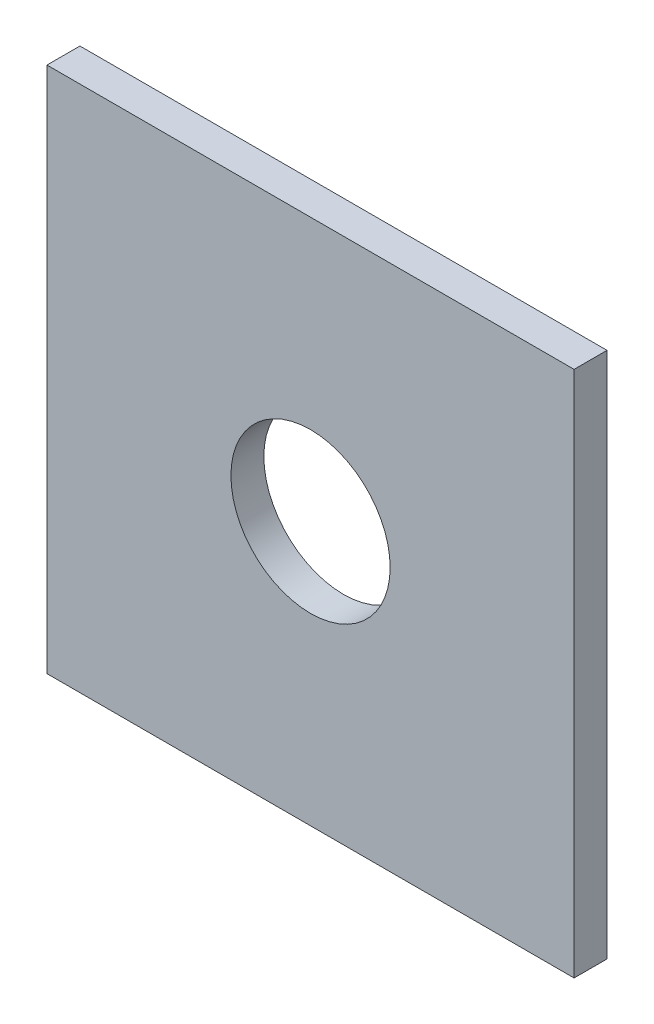
ISO-10303-21;
HEADER;
FILE_DESCRIPTION(('STEP AP214'),'2;1');
FILE_NAME('part.step','',(''),(''),'','','');
FILE_SCHEMA(('AUTOMOTIVE_DESIGN { 1 0 10303 214 1 1 1 1 }'));
ENDSEC;
DATA;
#1=APPLICATION_CONTEXT('core data for automotive mechanical design processes');
#2=APPLICATION_PROTOCOL_DEFINITION('international standard','automotive_design',2000,#1);
#3=PRODUCT_CONTEXT('',#1,'mechanical');
#4=PRODUCT('Part','Part','',(#3));
#5=PRODUCT_RELATED_PRODUCT_CATEGORY('part','',(#4));
#6=PRODUCT_DEFINITION_FORMATION('','',#4);
#7=PRODUCT_DEFINITION_CONTEXT('part definition',#1,'design');
#8=PRODUCT_DEFINITION('design','',#6,#7);
#9=PRODUCT_DEFINITION_SHAPE('','',#8);
#10=(LENGTH_UNIT() NAMED_UNIT(*) SI_UNIT(.MILLI.,.METRE.));
#11=(NAMED_UNIT(*) PLANE_ANGLE_UNIT() SI_UNIT($,.RADIAN.));
#12=(NAMED_UNIT(*) SI_UNIT($,.STERADIAN.) SOLID_ANGLE_UNIT());
#13=UNCERTAINTY_MEASURE_WITH_UNIT(LENGTH_MEASURE(1.E-05),#10,'distance_accuracy_value','');
#14=(GEOMETRIC_REPRESENTATION_CONTEXT(3) GLOBAL_UNCERTAINTY_ASSIGNED_CONTEXT((#13)) GLOBAL_UNIT_ASSIGNED_CONTEXT((#10,
#11,#12)) REPRESENTATION_CONTEXT('',''));
#15=CARTESIAN_POINT('',(0.,0.,0.));
#16=DIRECTION('',(0.,0.,1.));
#17=DIRECTION('',(1.,0.,0.));
#18=AXIS2_PLACEMENT_3D('',#15,#16,#17);
#19=CARTESIAN_POINT('',(0.,0.,19.05));
#20=DIRECTION('',(0.,0.,-1.));
#21=DIRECTION('',(-1.,0.,0.));
#22=AXIS2_PLACEMENT_3D('',#19,#20,#21);
#23=PLANE('',#22);
#24=DIRECTION('',(0.,-1.,0.));
#25=VECTOR('',#24,1.);
#26=CARTESIAN_POINT('',(-152.4,152.4,19.05));
#27=LINE('',#26,#25);
#28=CARTESIAN_POINT('',(-152.4,152.4,19.05));
#29=VERTEX_POINT('',#28);
#30=CARTESIAN_POINT('',(-152.4,-152.4,19.05));
#31=VERTEX_POINT('',#30);
#32=EDGE_CURVE('E94',#29,#31,#27,.T.);
#33=ORIENTED_EDGE('',*,*,#32,.T.);
#34=DIRECTION('',(1.,0.,0.));
#35=VECTOR('',#34,1.);
#36=CARTESIAN_POINT('',(152.4,-152.4,19.05));
#37=LINE('',#36,#35);
#38=CARTESIAN_POINT('',(152.4,-152.4,19.05));
#39=VERTEX_POINT('',#38);
#40=EDGE_CURVE('E89',#31,#39,#37,.T.);
#41=ORIENTED_EDGE('',*,*,#40,.T.);
#42=DIRECTION('',(0.,1.,0.));
#43=VECTOR('',#42,1.);
#44=CARTESIAN_POINT('',(152.4,152.4,19.05));
#45=LINE('',#44,#43);
#46=CARTESIAN_POINT('',(152.4,152.4,19.05));
#47=VERTEX_POINT('',#46);
#48=EDGE_CURVE('E92',#39,#47,#45,.T.);
#49=ORIENTED_EDGE('',*,*,#48,.T.);
#50=DIRECTION('',(-1.,0.,0.));
#51=VECTOR('',#50,1.);
#52=CARTESIAN_POINT('',(152.4,152.4,19.05));
#53=LINE('',#52,#51);
#54=EDGE_CURVE('E59',#47,#29,#53,.T.);
#55=ORIENTED_EDGE('',*,*,#54,.T.);
#56=EDGE_LOOP('',(#33,#41,#49,#55));
#57=FACE_BOUND('',#56,.T.);
#58=CARTESIAN_POINT('',(0.,0.,19.05));
#59=DIRECTION('',(0.,0.,1.));
#60=DIRECTION('',(1.,0.,0.));
#61=AXIS2_PLACEMENT_3D('',#58,#59,#60);
#62=CIRCLE('',#61,46.0375);
#63=CARTESIAN_POINT('',(-46.0375000000001,0.,19.05));
#64=VERTEX_POINT('',#63);
#65=EDGE_CURVE('E114',#64,#64,#62,.T.);
#66=ORIENTED_EDGE('',*,*,#65,.F.);
#67=EDGE_LOOP('',(#66));
#68=FACE_BOUND('',#67,.T.);
#69=ADVANCED_FACE('F41',(#57,#68),#23,.F.);
#70=CARTESIAN_POINT('',(0.,0.,0.));
#71=DIRECTION('',(0.,0.,-1.));
#72=DIRECTION('',(-1.,0.,0.));
#73=AXIS2_PLACEMENT_3D('',#70,#71,#72);
#74=PLANE('',#73);
#75=CARTESIAN_POINT('',(-71.8420489685531,71.8420489685533,0.));
#76=DIRECTION('',(0.,0.,1.));
#77=DIRECTION('',(1.,0.,0.));
#78=AXIS2_PLACEMENT_3D('',#75,#76,#77);
#79=CIRCLE('',#78,7.9375);
#80=CARTESIAN_POINT('',(-63.9045489685531,71.8420489685533,0.));
#81=VERTEX_POINT('',#80);
#82=EDGE_CURVE('E144',#81,#81,#79,.T.);
#83=ORIENTED_EDGE('',*,*,#82,.T.);
#84=EDGE_LOOP('',(#83));
#85=FACE_BOUND('',#84,.T.);
#86=CARTESIAN_POINT('',(71.8420489685531,-71.8420489685533,0.));
#87=DIRECTION('',(0.,0.,1.));
#88=DIRECTION('',(1.,0.,0.));
#89=AXIS2_PLACEMENT_3D('',#86,#87,#88);
#90=CIRCLE('',#89,7.9375);
#91=CARTESIAN_POINT('',(79.7795489685531,-71.8420489685533,0.));
#92=VERTEX_POINT('',#91);
#93=EDGE_CURVE('E145',#92,#92,#90,.T.);
#94=ORIENTED_EDGE('',*,*,#93,.T.);
#95=EDGE_LOOP('',(#94));
#96=FACE_BOUND('',#95,.T.);
#97=DIRECTION('',(0.,-1.,0.));
#98=VECTOR('',#97,1.);
#99=CARTESIAN_POINT('',(-152.4,152.4,0.));
#100=LINE('',#99,#98);
#101=CARTESIAN_POINT('',(-152.4,152.4,0.));
#102=VERTEX_POINT('',#101);
#103=CARTESIAN_POINT('',(-152.4,-152.4,0.));
#104=VERTEX_POINT('',#103);
#105=EDGE_CURVE('E110',#102,#104,#100,.T.);
#106=ORIENTED_EDGE('',*,*,#105,.F.);
#107=DIRECTION('',(-1.,0.,0.));
#108=VECTOR('',#107,1.);
#109=CARTESIAN_POINT('',(152.4,152.4,0.));
#110=LINE('',#109,#108);
#111=CARTESIAN_POINT('',(152.4,152.4,0.));
#112=VERTEX_POINT('',#111);
#113=EDGE_CURVE('E82',#112,#102,#110,.T.);
#114=ORIENTED_EDGE('',*,*,#113,.F.);
#115=DIRECTION('',(0.,1.,0.));
#116=VECTOR('',#115,1.);
#117=CARTESIAN_POINT('',(152.4,152.4,0.));
#118=LINE('',#117,#116);
#119=CARTESIAN_POINT('',(152.4,-152.4,0.));
#120=VERTEX_POINT('',#119);
#121=EDGE_CURVE('E76',#120,#112,#118,.T.);
#122=ORIENTED_EDGE('',*,*,#121,.F.);
#123=DIRECTION('',(1.,0.,0.));
#124=VECTOR('',#123,1.);
#125=CARTESIAN_POINT('',(152.4,-152.4,0.));
#126=LINE('',#125,#124);
#127=EDGE_CURVE('E99',#104,#120,#126,.T.);
#128=ORIENTED_EDGE('',*,*,#127,.F.);
#129=EDGE_LOOP('',(#106,#114,#122,#128));
#130=FACE_BOUND('',#129,.T.);
#131=CARTESIAN_POINT('',(0.,0.,0.));
#132=DIRECTION('',(0.,0.,1.));
#133=DIRECTION('',(1.,0.,0.));
#134=AXIS2_PLACEMENT_3D('',#131,#132,#133);
#135=CIRCLE('',#134,46.0375);
#136=CARTESIAN_POINT('',(-46.0375000000001,0.,0.));
#137=VERTEX_POINT('',#136);
#138=EDGE_CURVE('E132',#137,#137,#135,.T.);
#139=ORIENTED_EDGE('',*,*,#138,.T.);
#140=EDGE_LOOP('',(#139));
#141=FACE_BOUND('',#140,.T.);
#142=ADVANCED_FACE('F127',(#85,#96,#130,#141),#74,.T.);
#143=CARTESIAN_POINT('',(-152.4,152.4,19.05));
#144=DIRECTION('',(1.,0.,0.));
#145=DIRECTION('',(0.,1.,0.));
#146=AXIS2_PLACEMENT_3D('',#143,#144,#145);
#147=PLANE('',#146);
#148=ORIENTED_EDGE('',*,*,#105,.T.);
#149=DIRECTION('',(0.,0.,-1.));
#150=VECTOR('',#149,1.);
#151=CARTESIAN_POINT('',(-152.4,-152.4,19.05));
#152=LINE('',#151,#150);
#153=EDGE_CURVE('E12',#31,#104,#152,.T.);
#154=ORIENTED_EDGE('',*,*,#153,.F.);
#155=ORIENTED_EDGE('',*,*,#32,.F.);
#156=DIRECTION('',(0.,0.,-1.));
#157=VECTOR('',#156,1.);
#158=CARTESIAN_POINT('',(-152.4,152.4,19.05));
#159=LINE('',#158,#157);
#160=EDGE_CURVE('E106',#29,#102,#159,.T.);
#161=ORIENTED_EDGE('',*,*,#160,.T.);
#162=EDGE_LOOP('',(#148,#154,#155,#161));
#163=FACE_BOUND('',#162,.T.);
#164=ADVANCED_FACE('F43',(#163),#147,.F.);
#165=CARTESIAN_POINT('',(152.4,-152.4,19.05));
#166=DIRECTION('',(0.,1.,0.));
#167=DIRECTION('',(-1.,0.,0.));
#168=AXIS2_PLACEMENT_3D('',#165,#166,#167);
#169=PLANE('',#168);
#170=ORIENTED_EDGE('',*,*,#127,.T.);
#171=DIRECTION('',(0.,0.,-1.));
#172=VECTOR('',#171,1.);
#173=CARTESIAN_POINT('',(152.4,-152.4,19.05));
#174=LINE('',#173,#172);
#175=EDGE_CURVE('E51',#39,#120,#174,.T.);
#176=ORIENTED_EDGE('',*,*,#175,.F.);
#177=ORIENTED_EDGE('',*,*,#40,.F.);
#178=ORIENTED_EDGE('',*,*,#153,.T.);
#179=EDGE_LOOP('',(#170,#176,#177,#178));
#180=FACE_BOUND('',#179,.T.);
#181=ADVANCED_FACE('F98',(#180),#169,.F.);
#182=CARTESIAN_POINT('',(152.4,152.4,19.05));
#183=DIRECTION('',(-1.,0.,0.));
#184=DIRECTION('',(0.,-1.,0.));
#185=AXIS2_PLACEMENT_3D('',#182,#183,#184);
#186=PLANE('',#185);
#187=ORIENTED_EDGE('',*,*,#121,.T.);
#188=DIRECTION('',(0.,0.,-1.));
#189=VECTOR('',#188,1.);
#190=CARTESIAN_POINT('',(152.4,152.4,19.05));
#191=LINE('',#190,#189);
#192=EDGE_CURVE('E101',#47,#112,#191,.T.);
#193=ORIENTED_EDGE('',*,*,#192,.F.);
#194=ORIENTED_EDGE('',*,*,#48,.F.);
#195=ORIENTED_EDGE('',*,*,#175,.T.);
#196=EDGE_LOOP('',(#187,#193,#194,#195));
#197=FACE_BOUND('',#196,.T.);
#198=ADVANCED_FACE('F102',(#197),#186,.F.);
#199=CARTESIAN_POINT('',(152.4,152.4,19.05));
#200=DIRECTION('',(0.,-1.,0.));
#201=DIRECTION('',(1.,0.,0.));
#202=AXIS2_PLACEMENT_3D('',#199,#200,#201);
#203=PLANE('',#202);
#204=ORIENTED_EDGE('',*,*,#113,.T.);
#205=ORIENTED_EDGE('',*,*,#160,.F.);
#206=ORIENTED_EDGE('',*,*,#54,.F.);
#207=ORIENTED_EDGE('',*,*,#192,.T.);
#208=EDGE_LOOP('',(#204,#205,#206,#207));
#209=FACE_BOUND('',#208,.T.);
#210=ADVANCED_FACE('F124',(#209),#203,.F.);
#211=CARTESIAN_POINT('',(0.,0.,19.05));
#212=DIRECTION('',(0.,0.,-1.));
#213=DIRECTION('',(-1.,0.,0.));
#214=AXIS2_PLACEMENT_3D('',#211,#212,#213);
#215=CYLINDRICAL_SURFACE('',#214,46.0375);
#216=CARTESIAN_POINT('',(-46.0375000000001,0.,19.05));
#217=CARTESIAN_POINT('',(-46.0375000000001,0.,18.8515625));
#218=CARTESIAN_POINT('',(-46.0375000000001,0.,18.653125));
#219=CARTESIAN_POINT('',(-46.0375000000001,0.,18.25625));
#220=CARTESIAN_POINT('',(-46.0375000000001,0.,18.0578125));
#221=CARTESIAN_POINT('',(-46.0375000000001,0.,17.6609375));
#222=CARTESIAN_POINT('',(-46.0375000000001,0.,17.4625));
#223=CARTESIAN_POINT('',(-46.0375000000001,0.,17.065625));
#224=CARTESIAN_POINT('',(-46.0375000000001,0.,16.8671875));
#225=CARTESIAN_POINT('',(-46.0375000000001,0.,16.4703125));
#226=CARTESIAN_POINT('',(-46.0375000000001,0.,16.271875));
#227=CARTESIAN_POINT('',(-46.0375000000001,0.,15.875));
#228=CARTESIAN_POINT('',(-46.0375000000001,0.,15.6765625));
#229=CARTESIAN_POINT('',(-46.0375000000001,0.,15.2796875));
#230=CARTESIAN_POINT('',(-46.0375000000001,0.,15.08125));
#231=CARTESIAN_POINT('',(-46.0375000000001,0.,14.684375));
#232=CARTESIAN_POINT('',(-46.0375000000001,0.,14.4859375));
#233=CARTESIAN_POINT('',(-46.0375000000001,0.,14.0890625));
#234=CARTESIAN_POINT('',(-46.0375000000001,0.,13.890625));
#235=CARTESIAN_POINT('',(-46.0375000000001,0.,13.49375));
#236=CARTESIAN_POINT('',(-46.0375000000001,0.,13.2953125));
#237=CARTESIAN_POINT('',(-46.0375000000001,0.,12.8984375));
#238=CARTESIAN_POINT('',(-46.0375000000001,0.,12.7));
#239=CARTESIAN_POINT('',(-46.0375000000001,0.,12.303125));
#240=CARTESIAN_POINT('',(-46.0375000000001,0.,12.1046875));
#241=CARTESIAN_POINT('',(-46.0375000000001,0.,11.7078125));
#242=CARTESIAN_POINT('',(-46.0375000000001,0.,11.509375));
#243=CARTESIAN_POINT('',(-46.0375000000001,0.,11.1125));
#244=CARTESIAN_POINT('',(-46.0375000000001,0.,10.9140625));
#245=CARTESIAN_POINT('',(-46.0375000000001,0.,10.5171875));
#246=CARTESIAN_POINT('',(-46.0375000000001,0.,10.31875));
#247=CARTESIAN_POINT('',(-46.0375000000001,0.,9.921875));
#248=CARTESIAN_POINT('',(-46.0375000000001,0.,9.7234375));
#249=CARTESIAN_POINT('',(-46.0375000000001,0.,9.3265625));
#250=CARTESIAN_POINT('',(-46.0375000000001,0.,9.128125));
#251=CARTESIAN_POINT('',(-46.0375000000001,0.,8.73125));
#252=CARTESIAN_POINT('',(-46.0375000000001,0.,8.5328125));
#253=CARTESIAN_POINT('',(-46.0375000000001,0.,8.1359375));
#254=CARTESIAN_POINT('',(-46.0375000000001,0.,7.9375));
#255=CARTESIAN_POINT('',(-46.0375000000001,0.,7.540625));
#256=CARTESIAN_POINT('',(-46.0375000000001,0.,7.3421875));
#257=CARTESIAN_POINT('',(-46.0375000000001,0.,6.9453125));
#258=CARTESIAN_POINT('',(-46.0375000000001,0.,6.746875));
#259=CARTESIAN_POINT('',(-46.0375000000001,0.,6.35));
#260=CARTESIAN_POINT('',(-46.0375000000001,0.,6.1515625));
#261=CARTESIAN_POINT('',(-46.0375000000001,0.,5.7546875));
#262=CARTESIAN_POINT('',(-46.0375000000001,0.,5.55625));
#263=CARTESIAN_POINT('',(-46.0375000000001,0.,5.159375));
#264=CARTESIAN_POINT('',(-46.0375000000001,0.,4.9609375));
#265=CARTESIAN_POINT('',(-46.0375000000001,0.,4.5640625));
#266=CARTESIAN_POINT('',(-46.0375000000001,0.,4.365625));
#267=CARTESIAN_POINT('',(-46.0375000000001,0.,3.96875));
#268=CARTESIAN_POINT('',(-46.0375000000001,0.,3.7703125));
#269=CARTESIAN_POINT('',(-46.0375000000001,0.,3.3734375));
#270=CARTESIAN_POINT('',(-46.0375000000001,0.,3.175));
#271=CARTESIAN_POINT('',(-46.0375000000001,0.,2.778125));
#272=CARTESIAN_POINT('',(-46.0375000000001,0.,2.5796875));
#273=CARTESIAN_POINT('',(-46.0375000000001,0.,2.1828125));
#274=CARTESIAN_POINT('',(-46.0375000000001,0.,1.984375));
#275=CARTESIAN_POINT('',(-46.0375000000001,0.,1.5875));
#276=CARTESIAN_POINT('',(-46.0375000000001,0.,1.3890625));
#277=CARTESIAN_POINT('',(-46.0375000000001,0.,0.992187500000001));
#278=CARTESIAN_POINT('',(-46.0375000000001,0.,0.793750000000001));
#279=CARTESIAN_POINT('',(-46.0375000000001,0.,0.396875));
#280=CARTESIAN_POINT('',(-46.0375000000001,0.,0.1984375));
#281=CARTESIAN_POINT('',(-46.0375000000001,0.,0.));
#282=B_SPLINE_CURVE_WITH_KNOTS('',3,(#216,#217,#218,#219,#220,#221,#222,#223,#224,#225,#226,
#227,#228,#229,#230,#231,#232,#233,#234,#235,#236,#237,#238,#239,#240,#241,#242,#243,#244,#245,
#246,#247,#248,#249,#250,#251,#252,#253,#254,#255,#256,#257,#258,#259,#260,#261,#262,#263,#264,
#265,#266,#267,#268,#269,#270,#271,#272,#273,#274,#275,#276,#277,#278,#279,#280,#281),
.UNSPECIFIED.,.F.,.F.,(4,2,2,2,2,2,2,2,2,2,2,2,2,2,2,2,2,2,2,2,2,2,2,2,2,2,2,2,2,2,2,2,4),(0.,
0.595312499999997,1.190625,1.7859375,2.38125,2.9765625,3.571875,4.1671875,4.7625,5.3578125,
5.953125,6.5484375,7.14375,7.7390625,8.334375,8.9296875,9.525,10.1203125,10.715625,11.3109375,
11.90625,12.5015625,13.096875,13.6921875,14.2875,14.8828125,15.478125,16.0734375,16.66875,
17.2640625,17.859375,18.4546875,19.05),.UNSPECIFIED.);
#283=EDGE_CURVE('BSEAM181',#64,#137,#282,.T.);
#284=ORIENTED_EDGE('',*,*,#65,.T.);
#285=ORIENTED_EDGE('',*,*,#138,.F.);
#286=ORIENTED_EDGE('',*,*,#283,.T.);
#287=ORIENTED_EDGE('',*,*,#283,.F.);
#288=EDGE_LOOP('',(#284,#286,#285,#287));
#289=FACE_BOUND('',#288,.T.);
#290=ADVANCED_FACE('F181',(#289),#215,.F.);
#291=CARTESIAN_POINT('',(71.8420489685531,-71.8420489685533,41.5006403026729));
#292=DIRECTION('',(0.,0.,-1.));
#293=DIRECTION('',(-1.,0.,0.));
#294=AXIS2_PLACEMENT_3D('',#291,#292,#293);
#295=CYLINDRICAL_SURFACE('',#294,7.9375);
#296=CARTESIAN_POINT('',(71.8420489685531,-71.8420489685533,15.875));
#297=DIRECTION('',(0.,0.,-1.));
#298=DIRECTION('',(-1.,0.,0.));
#299=AXIS2_PLACEMENT_3D('',#296,#297,#298);
#300=CIRCLE('',#299,7.9375);
#301=CARTESIAN_POINT('',(63.9045489685531,-71.8420489685533,15.875));
#302=VERTEX_POINT('',#301);
#303=EDGE_CURVE('E140',#302,#302,#300,.T.);
#304=ORIENTED_EDGE('',*,*,#303,.F.);
#305=EDGE_LOOP('',(#304));
#306=FACE_BOUND('',#305,.T.);
#307=ORIENTED_EDGE('',*,*,#93,.F.);
#308=EDGE_LOOP('',(#307));
#309=FACE_BOUND('',#308,.T.);
#310=ADVANCED_FACE('F170',(#306,#309),#295,.F.);
#311=CARTESIAN_POINT('',(0.,0.,15.875));
#312=DIRECTION('',(0.,0.,-1.));
#313=DIRECTION('',(-1.,0.,0.));
#314=AXIS2_PLACEMENT_3D('',#311,#312,#313);
#315=PLANE('',#314);
#316=ORIENTED_EDGE('',*,*,#303,.T.);
#317=EDGE_LOOP('',(#316));
#318=FACE_BOUND('',#317,.T.);
#319=ADVANCED_FACE('F161',(#318),#315,.T.);
#320=CARTESIAN_POINT('',(-71.8420489685531,71.8420489685533,41.5006403026729));
#321=DIRECTION('',(0.,0.,-1.));
#322=DIRECTION('',(-1.,0.,0.));
#323=AXIS2_PLACEMENT_3D('',#320,#321,#322);
#324=CYLINDRICAL_SURFACE('',#323,7.9375);
#325=CARTESIAN_POINT('',(-71.8420489685531,71.8420489685533,15.875));
#326=DIRECTION('',(0.,0.,-1.));
#327=DIRECTION('',(-1.,0.,0.));
#328=AXIS2_PLACEMENT_3D('',#325,#326,#327);
#329=CIRCLE('',#328,7.9375);
#330=CARTESIAN_POINT('',(-79.7795489685531,71.8420489685533,15.875));
#331=VERTEX_POINT('',#330);
#332=EDGE_CURVE('E136',#331,#331,#329,.T.);
#333=ORIENTED_EDGE('',*,*,#332,.F.);
#334=EDGE_LOOP('',(#333));
#335=FACE_BOUND('',#334,.T.);
#336=ORIENTED_EDGE('',*,*,#82,.F.);
#337=EDGE_LOOP('',(#336));
#338=FACE_BOUND('',#337,.T.);
#339=ADVANCED_FACE('F158',(#335,#338),#324,.F.);
#340=CARTESIAN_POINT('',(0.,0.,15.875));
#341=DIRECTION('',(0.,0.,-1.));
#342=DIRECTION('',(-1.,0.,0.));
#343=AXIS2_PLACEMENT_3D('',#340,#341,#342);
#344=PLANE('',#343);
#345=ORIENTED_EDGE('',*,*,#332,.T.);
#346=EDGE_LOOP('',(#345));
#347=FACE_BOUND('',#346,.T.);
#348=ADVANCED_FACE('F160',(#347),#344,.T.);
#349=CLOSED_SHELL('',(#69,#142,#164,#181,#198,#210,#290,#310,#319,#339,#348));
#350=MANIFOLD_SOLID_BREP('B2',#349);
#351=ADVANCED_BREP_SHAPE_REPRESENTATION('',(#18,#350),#14);
#352=SHAPE_DEFINITION_REPRESENTATION(#9,#351);
ENDSEC;
END-ISO-10303-21;
